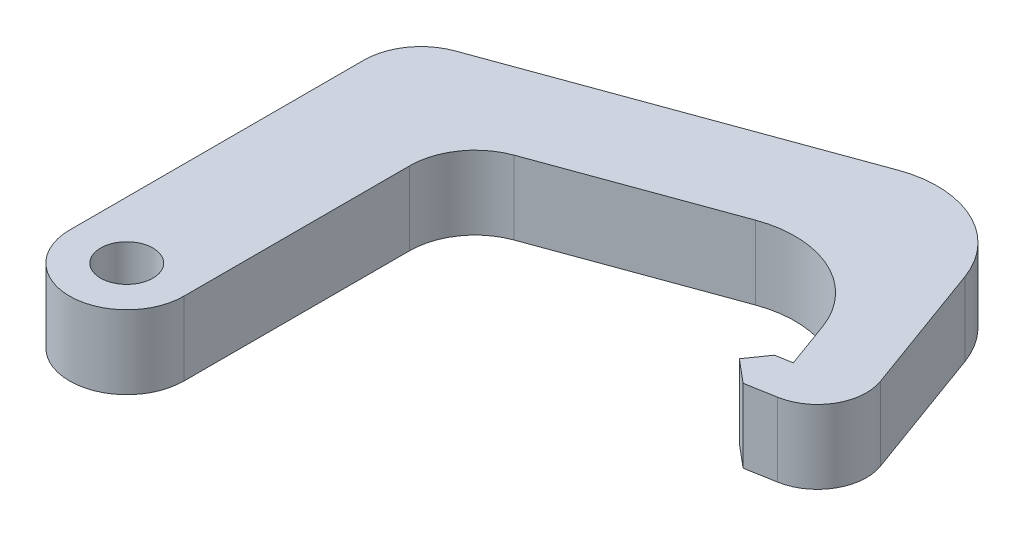
ISO-10303-21;
HEADER;
FILE_DESCRIPTION(('STEP AP214'),'2;1');
FILE_NAME('part.step','',(''),(''),'','','');
FILE_SCHEMA(('AUTOMOTIVE_DESIGN { 1 0 10303 214 1 1 1 1 }'));
ENDSEC;
DATA;
#1=APPLICATION_CONTEXT('core data for automotive mechanical design processes');
#2=APPLICATION_PROTOCOL_DEFINITION('international standard','automotive_design',2000,#1);
#3=PRODUCT_CONTEXT('',#1,'mechanical');
#4=PRODUCT('Part','Part','',(#3));
#5=PRODUCT_RELATED_PRODUCT_CATEGORY('part','',(#4));
#6=PRODUCT_DEFINITION_FORMATION('','',#4);
#7=PRODUCT_DEFINITION_CONTEXT('part definition',#1,'design');
#8=PRODUCT_DEFINITION('design','',#6,#7);
#9=PRODUCT_DEFINITION_SHAPE('','',#8);
#10=(LENGTH_UNIT() NAMED_UNIT(*) SI_UNIT(.MILLI.,.METRE.));
#11=(NAMED_UNIT(*) PLANE_ANGLE_UNIT() SI_UNIT($,.RADIAN.));
#12=(NAMED_UNIT(*) SI_UNIT($,.STERADIAN.) SOLID_ANGLE_UNIT());
#13=UNCERTAINTY_MEASURE_WITH_UNIT(LENGTH_MEASURE(1.E-05),#10,'distance_accuracy_value','');
#14=(GEOMETRIC_REPRESENTATION_CONTEXT(3) GLOBAL_UNCERTAINTY_ASSIGNED_CONTEXT((#13)) GLOBAL_UNIT_ASSIGNED_CONTEXT((#10,
#11,#12)) REPRESENTATION_CONTEXT('',''));
#15=CARTESIAN_POINT('',(0.,0.,0.));
#16=DIRECTION('',(0.,0.,1.));
#17=DIRECTION('',(1.,0.,0.));
#18=AXIS2_PLACEMENT_3D('',#15,#16,#17);
#19=CARTESIAN_POINT('',(3.5,4.5,0.));
#20=DIRECTION('',(-1.,0.,0.));
#21=DIRECTION('',(0.,0.,1.));
#22=AXIS2_PLACEMENT_3D('',#19,#20,#21);
#23=PLANE('',#22);
#24=DIRECTION('',(0.,0.,-1.));
#25=VECTOR('',#24,1.);
#26=CARTESIAN_POINT('',(3.5,0.,0.));
#27=LINE('',#26,#25);
#28=CARTESIAN_POINT('',(3.5,0.,0.));
#29=VERTEX_POINT('',#28);
#30=CARTESIAN_POINT('',(3.5,0.,-13.8126212359031));
#31=VERTEX_POINT('',#30);
#32=EDGE_CURVE('E205',#29,#31,#27,.T.);
#33=ORIENTED_EDGE('',*,*,#32,.T.);
#34=DIRECTION('',(0.,-1.,0.));
#35=VECTOR('',#34,1.);
#36=CARTESIAN_POINT('',(3.5,4.5,-13.8126212359031));
#37=LINE('',#36,#35);
#38=CARTESIAN_POINT('',(3.5,4.5,-13.8126212359031));
#39=VERTEX_POINT('',#38);
#40=EDGE_CURVE('E244',#31,#39,#37,.F.);
#41=ORIENTED_EDGE('',*,*,#40,.T.);
#42=DIRECTION('',(0.,0.,-1.));
#43=VECTOR('',#42,1.);
#44=CARTESIAN_POINT('',(3.5,4.5,0.));
#45=LINE('',#44,#43);
#46=CARTESIAN_POINT('',(3.5,4.5,0.));
#47=VERTEX_POINT('',#46);
#48=EDGE_CURVE('E343',#47,#39,#45,.T.);
#49=ORIENTED_EDGE('',*,*,#48,.F.);
#50=DIRECTION('',(0.,-1.,0.));
#51=VECTOR('',#50,1.);
#52=CARTESIAN_POINT('',(3.5,4.5,0.));
#53=LINE('',#52,#51);
#54=EDGE_CURVE('E201',#47,#29,#53,.T.);
#55=ORIENTED_EDGE('',*,*,#54,.T.);
#56=EDGE_LOOP('',(#33,#41,#49,#55));
#57=FACE_BOUND('',#56,.T.);
#58=ADVANCED_FACE('F45',(#57),#23,.F.);
#59=CARTESIAN_POINT('',(-4.93003812886465,4.5,-13.5451684361061));
#60=DIRECTION('',(0.342020143325666,0.,0.939692620785909));
#61=DIRECTION('',(0.93969262078591,0.,-0.342020143325666));
#62=AXIS2_PLACEMENT_3D('',#59,#60,#61);
#63=PLANE('',#62);
#64=DIRECTION('',(-0.939692620785909,0.,0.342020143325666));
#65=VECTOR('',#64,1.);
#66=CARTESIAN_POINT('',(-4.93003812886465,0.,-13.5451684361061));
#67=LINE('',#66,#65);
#68=CARTESIAN_POINT('',(16.959118700357,0.,-21.5121699751274));
#69=VERTEX_POINT('',#68);
#70=CARTESIAN_POINT('',(6.13191942669734,0.,-17.5713917190467));
#71=VERTEX_POINT('',#70);
#72=EDGE_CURVE('E208',#69,#71,#67,.T.);
#73=ORIENTED_EDGE('',*,*,#72,.F.);
#74=DIRECTION('',(0.,-1.,0.));
#75=VECTOR('',#74,1.);
#76=CARTESIAN_POINT('',(16.959118700357,4.5,-21.5121699751274));
#77=LINE('',#76,#75);
#78=CARTESIAN_POINT('',(16.959118700357,4.5,-21.5121699751274));
#79=VERTEX_POINT('',#78);
#80=EDGE_CURVE('E262',#69,#79,#77,.F.);
#81=ORIENTED_EDGE('',*,*,#80,.T.);
#82=DIRECTION('',(-0.939692620785909,0.,0.342020143325666));
#83=VECTOR('',#82,1.);
#84=CARTESIAN_POINT('',(-4.93003812886465,4.5,-13.5451684361061));
#85=LINE('',#84,#83);
#86=CARTESIAN_POINT('',(6.13191942669734,4.5,-17.5713917190467));
#87=VERTEX_POINT('',#86);
#88=EDGE_CURVE('E169',#79,#87,#85,.T.);
#89=ORIENTED_EDGE('',*,*,#88,.T.);
#90=DIRECTION('',(0.,-1.,0.));
#91=VECTOR('',#90,1.);
#92=CARTESIAN_POINT('',(6.13191942669734,4.5,-17.5713917190467));
#93=LINE('',#92,#91);
#94=EDGE_CURVE('E176',#87,#71,#93,.T.);
#95=ORIENTED_EDGE('',*,*,#94,.T.);
#96=EDGE_LOOP('',(#73,#81,#89,#95));
#97=FACE_BOUND('',#96,.T.);
#98=ADVANCED_FACE('F302',(#97),#63,.T.);
#99=CARTESIAN_POINT('',(27.5273125539371,4.5,-10.0191223989754));
#100=DIRECTION('',(0.939692620785909,0.,-0.342020143325666));
#101=DIRECTION('',(-0.342020143325666,0.,-0.939692620785909));
#102=AXIS2_PLACEMENT_3D('',#99,#100,#101);
#103=PLANE('',#102);
#104=DIRECTION('',(0.342020143325666,0.,0.939692620785909));
#105=VECTOR('',#104,1.);
#106=CARTESIAN_POINT('',(27.5273125539371,4.5,-10.0191223989754));
#107=LINE('',#106,#105);
#108=CARTESIAN_POINT('',(24.6493952850264,4.5,-17.926135110366));
#109=VERTEX_POINT('',#108);
#110=CARTESIAN_POINT('',(25.6754557150034,4.5,-15.1070572480082));
#111=VERTEX_POINT('',#110);
#112=EDGE_CURVE('E158',#109,#111,#107,.T.);
#113=ORIENTED_EDGE('',*,*,#112,.F.);
#114=DIRECTION('',(0.,-1.,0.));
#115=VECTOR('',#114,1.);
#116=CARTESIAN_POINT('',(24.6493952850264,4.5,-17.926135110366));
#117=LINE('',#116,#115);
#118=CARTESIAN_POINT('',(24.6493952850264,0.,-17.926135110366));
#119=VERTEX_POINT('',#118);
#120=EDGE_CURVE('E260',#109,#119,#117,.T.);
#121=ORIENTED_EDGE('',*,*,#120,.T.);
#122=DIRECTION('',(0.342020143325666,0.,0.939692620785909));
#123=VECTOR('',#122,1.);
#124=CARTESIAN_POINT('',(27.5273125539371,0.,-10.0191223989754));
#125=LINE('',#124,#123);
#126=CARTESIAN_POINT('',(25.6754557150034,0.,-15.1070572480082));
#127=VERTEX_POINT('',#126);
#128=EDGE_CURVE('E175',#119,#127,#125,.T.);
#129=ORIENTED_EDGE('',*,*,#128,.T.);
#130=DIRECTION('',(0.,-1.,0.));
#131=VECTOR('',#130,1.);
#132=CARTESIAN_POINT('',(25.6754557150034,4.5,-15.1070572480082));
#133=LINE('',#132,#131);
#134=EDGE_CURVE('E172',#111,#127,#133,.T.);
#135=ORIENTED_EDGE('',*,*,#134,.F.);
#136=EDGE_LOOP('',(#113,#121,#129,#135));
#137=FACE_BOUND('',#136,.T.);
#138=ADVANCED_FACE('F173',(#137),#103,.F.);
#139=CARTESIAN_POINT('',(-1.80924922044675,4.5,-10.2607622110774));
#140=DIRECTION('',(0.173648177666927,0.,0.984807753012209));
#141=DIRECTION('',(0.984807753012209,0.,-0.173648177666927));
#142=AXIS2_PLACEMENT_3D('',#139,#140,#141);
#143=PLANE('',#142);
#144=DIRECTION('',(-0.984807753012209,0.,0.173648177666927));
#145=VECTOR('',#144,1.);
#146=CARTESIAN_POINT('',(-1.80924922044675,0.,-10.2607622110774));
#147=LINE('',#146,#145);
#148=CARTESIAN_POINT('',(24.6906479619912,0.,-14.9334090703413));
#149=VERTEX_POINT('',#148);
#150=EDGE_CURVE('E211',#127,#149,#147,.T.);
#151=ORIENTED_EDGE('',*,*,#150,.T.);
#152=DIRECTION('',(0.,1.,0.));
#153=VECTOR('',#152,1.);
#154=CARTESIAN_POINT('',(24.6906479619912,4.5,-14.9334090703413));
#155=LINE('',#154,#153);
#156=CARTESIAN_POINT('',(24.6906479619912,4.5,-14.9334090703413));
#157=VERTEX_POINT('',#156);
#158=EDGE_CURVE('E54',#149,#157,#155,.T.);
#159=ORIENTED_EDGE('',*,*,#158,.T.);
#160=DIRECTION('',(-0.984807753012209,0.,0.173648177666927));
#161=VECTOR('',#160,1.);
#162=CARTESIAN_POINT('',(-1.80924922044675,4.5,-10.2607622110774));
#163=LINE('',#162,#161);
#164=EDGE_CURVE('E161',#111,#157,#163,.T.);
#165=ORIENTED_EDGE('',*,*,#164,.F.);
#166=ORIENTED_EDGE('',*,*,#134,.T.);
#167=EDGE_LOOP('',(#151,#159,#165,#166));
#168=FACE_BOUND('',#167,.T.);
#169=ADVANCED_FACE('F179',(#168),#143,.F.);
#170=CARTESIAN_POINT('',(16.5700417316632,4.5,-19.7474067631455));
#171=DIRECTION('',(-0.64278760968654,0.,0.766044443118978));
#172=DIRECTION('',(0.766044443118978,0.,0.64278760968654));
#173=AXIS2_PLACEMENT_3D('',#170,#171,#172);
#174=PLANE('',#173);
#175=DIRECTION('',(-0.766044443118978,0.,-0.64278760968654));
#176=VECTOR('',#175,1.);
#177=CARTESIAN_POINT('',(16.5700417316632,4.5,-19.7474067631455));
#178=LINE('',#177,#176);
#179=CARTESIAN_POINT('',(25.2210324559668,4.5,-12.4883636370643));
#180=VERTEX_POINT('',#179);
#181=CARTESIAN_POINT('',(23.8085211194927,4.5,-13.6736013785334));
#182=VERTEX_POINT('',#181);
#183=EDGE_CURVE('E180',#180,#182,#178,.T.);
#184=ORIENTED_EDGE('',*,*,#183,.T.);
#185=DIRECTION('',(0.,-1.,0.));
#186=VECTOR('',#185,1.);
#187=CARTESIAN_POINT('',(23.8085211194927,0.,-13.6736013785334));
#188=LINE('',#187,#186);
#189=CARTESIAN_POINT('',(23.8085211194927,0.,-13.6736013785334));
#190=VERTEX_POINT('',#189);
#191=EDGE_CURVE('E276',#182,#190,#188,.T.);
#192=ORIENTED_EDGE('',*,*,#191,.T.);
#193=DIRECTION('',(-0.766044443118978,0.,-0.64278760968654));
#194=VECTOR('',#193,1.);
#195=CARTESIAN_POINT('',(16.5700417316632,0.,-19.7474067631455));
#196=LINE('',#195,#194);
#197=CARTESIAN_POINT('',(25.2210324559668,0.,-12.4883636370643));
#198=VERTEX_POINT('',#197);
#199=EDGE_CURVE('E213',#198,#190,#196,.T.);
#200=ORIENTED_EDGE('',*,*,#199,.F.);
#201=DIRECTION('',(0.,-1.,0.));
#202=VECTOR('',#201,1.);
#203=CARTESIAN_POINT('',(25.2210324559668,4.5,-12.4883636370643));
#204=LINE('',#203,#202);
#205=EDGE_CURVE('E177',#180,#198,#204,.T.);
#206=ORIENTED_EDGE('',*,*,#205,.F.);
#207=EDGE_LOOP('',(#184,#192,#200,#206));
#208=FACE_BOUND('',#207,.T.);
#209=ADVANCED_FACE('F282',(#208),#174,.T.);
#210=CARTESIAN_POINT('',(-1.37512877627942,4.5,-7.79874282854692));
#211=DIRECTION('',(0.173648177666924,0.,0.984807753012209));
#212=DIRECTION('',(0.984807753012209,0.,-0.173648177666924));
#213=AXIS2_PLACEMENT_3D('',#210,#211,#212);
#214=PLANE('',#213);
#215=DIRECTION('',(-0.984807753012209,0.,0.173648177666924));
#216=VECTOR('',#215,1.);
#217=CARTESIAN_POINT('',(-1.37512877627942,0.,-7.79874282854692));
#218=LINE('',#217,#216);
#219=CARTESIAN_POINT('',(27.0227520703373,0.,-12.8060554167494));
#220=VERTEX_POINT('',#219);
#221=EDGE_CURVE('E215',#220,#198,#218,.T.);
#222=ORIENTED_EDGE('',*,*,#221,.F.);
#223=DIRECTION('',(0.,-1.,0.));
#224=VECTOR('',#223,1.);
#225=CARTESIAN_POINT('',(27.0227520703373,4.5,-12.8060554167494));
#226=LINE('',#225,#224);
#227=CARTESIAN_POINT('',(27.0227520703373,4.5,-12.8060554167494));
#228=VERTEX_POINT('',#227);
#229=EDGE_CURVE('E272',#220,#228,#226,.F.);
#230=ORIENTED_EDGE('',*,*,#229,.T.);
#231=DIRECTION('',(-0.984807753012209,0.,0.173648177666924));
#232=VECTOR('',#231,1.);
#233=CARTESIAN_POINT('',(-1.37512877627942,4.5,-7.79874282854692));
#234=LINE('',#233,#232);
#235=EDGE_CURVE('E183',#228,#180,#234,.T.);
#236=ORIENTED_EDGE('',*,*,#235,.T.);
#237=ORIENTED_EDGE('',*,*,#205,.T.);
#238=EDGE_LOOP('',(#222,#230,#236,#237));
#239=FACE_BOUND('',#238,.T.);
#240=ADVANCED_FACE('F290',(#239),#214,.T.);
#241=CARTESIAN_POINT('',(31.2860830370807,4.5,-11.387202972278));
#242=DIRECTION('',(0.939692620785909,0.,-0.342020143325666));
#243=DIRECTION('',(-0.342020143325666,0.,-0.93969262078591));
#244=AXIS2_PLACEMENT_3D('',#241,#242,#243);
#245=PLANE('',#244);
#246=DIRECTION('',(0.342020143325666,0.,0.939692620785909));
#247=VECTOR('',#246,1.);
#248=CARTESIAN_POINT('',(31.2860830370807,4.5,-11.387202972278));
#249=LINE('',#248,#247);
#250=CARTESIAN_POINT('',(26.3560449082161,4.5,-24.9323714083841));
#251=VERTEX_POINT('',#250);
#252=CARTESIAN_POINT('',(29.3208853996942,4.5,-16.786539105763));
#253=VERTEX_POINT('',#252);
#254=EDGE_CURVE('E188',#251,#253,#249,.T.);
#255=ORIENTED_EDGE('',*,*,#254,.T.);
#256=DIRECTION('',(0.,-1.,0.));
#257=VECTOR('',#256,1.);
#258=CARTESIAN_POINT('',(29.3208853996942,4.5,-16.786539105763));
#259=LINE('',#258,#257);
#260=CARTESIAN_POINT('',(29.3208853996942,0.,-16.786539105763));
#261=VERTEX_POINT('',#260);
#262=EDGE_CURVE('E267',#253,#261,#259,.T.);
#263=ORIENTED_EDGE('',*,*,#262,.T.);
#264=DIRECTION('',(0.342020143325666,0.,0.939692620785909));
#265=VECTOR('',#264,1.);
#266=CARTESIAN_POINT('',(31.2860830370807,0.,-11.387202972278));
#267=LINE('',#266,#265);
#268=CARTESIAN_POINT('',(26.3560449082161,0.,-24.9323714083841));
#269=VERTEX_POINT('',#268);
#270=EDGE_CURVE('E217',#269,#261,#267,.T.);
#271=ORIENTED_EDGE('',*,*,#270,.F.);
#272=DIRECTION('',(0.,-1.,0.));
#273=VECTOR('',#272,1.);
#274=CARTESIAN_POINT('',(26.3560449082161,4.5,-24.9323714083841));
#275=LINE('',#274,#273);
#276=EDGE_CURVE('E256',#269,#251,#275,.F.);
#277=ORIENTED_EDGE('',*,*,#276,.T.);
#278=EDGE_LOOP('',(#255,#263,#271,#277));
#279=FACE_BOUND('',#278,.T.);
#280=ADVANCED_FACE('F363',(#279),#245,.T.);
#281=CARTESIAN_POINT('',(-6.98215898881865,4.5,-19.1833241608215));
#282=DIRECTION('',(-0.342020143325666,0.,-0.939692620785909));
#283=DIRECTION('',(-0.93969262078591,0.,0.342020143325666));
#284=AXIS2_PLACEMENT_3D('',#281,#282,#283);
#285=PLANE('',#284);
#286=DIRECTION('',(0.939692620785909,0.,-0.342020143325666));
#287=VECTOR('',#286,1.);
#288=CARTESIAN_POINT('',(-6.98215898881865,4.5,-19.1833241608215));
#289=LINE('',#288,#287);
#290=CARTESIAN_POINT('',(-1.19707050163983,4.5,-21.2889241727507));
#291=VERTEX_POINT('',#290);
#292=CARTESIAN_POINT('',(18.6657683235466,4.5,-28.5184062731456));
#293=VERTEX_POINT('',#292);
#294=EDGE_CURVE('E191',#291,#293,#289,.T.);
#295=ORIENTED_EDGE('',*,*,#294,.T.);
#296=DIRECTION('',(0.,-1.,0.));
#297=VECTOR('',#296,1.);
#298=CARTESIAN_POINT('',(18.6657683235466,4.5,-28.5184062731456));
#299=LINE('',#298,#297);
#300=CARTESIAN_POINT('',(18.6657683235466,0.,-28.5184062731456));
#301=VERTEX_POINT('',#300);
#302=EDGE_CURVE('E251',#293,#301,#299,.T.);
#303=ORIENTED_EDGE('',*,*,#302,.T.);
#304=DIRECTION('',(0.939692620785909,0.,-0.342020143325666));
#305=VECTOR('',#304,1.);
#306=CARTESIAN_POINT('',(-6.98215898881865,0.,-19.1833241608215));
#307=LINE('',#306,#305);
#308=CARTESIAN_POINT('',(-1.19707050163983,0.,-21.2889241727507));
#309=VERTEX_POINT('',#308);
#310=EDGE_CURVE('E220',#309,#301,#307,.T.);
#311=ORIENTED_EDGE('',*,*,#310,.F.);
#312=DIRECTION('',(0.,-1.,0.));
#313=VECTOR('',#312,1.);
#314=CARTESIAN_POINT('',(-1.19707050163983,4.5,-21.2889241727507));
#315=LINE('',#314,#313);
#316=EDGE_CURVE('E238',#291,#309,#315,.T.);
#317=ORIENTED_EDGE('',*,*,#316,.F.);
#318=EDGE_LOOP('',(#295,#303,#311,#317));
#319=FACE_BOUND('',#318,.T.);
#320=ADVANCED_FACE('F356',(#319),#285,.T.);
#321=CARTESIAN_POINT('',(0.,4.5,-18.));
#322=DIRECTION('',(0.,-1.,0.));
#323=DIRECTION('',(0.,0.,-1.));
#324=AXIS2_PLACEMENT_3D('',#321,#322,#323);
#325=CYLINDRICAL_SURFACE('',#324,3.5);
#326=CARTESIAN_POINT('',(0.,0.,-18.));
#327=DIRECTION('',(0.,1.,0.));
#328=DIRECTION('',(0.,0.,1.));
#329=AXIS2_PLACEMENT_3D('',#326,#327,#328);
#330=CIRCLE('',#329,3.5);
#331=CARTESIAN_POINT('',(-3.5,0.,-18.));
#332=VERTEX_POINT('',#331);
#333=EDGE_CURVE('E223',#309,#332,#330,.T.);
#334=ORIENTED_EDGE('',*,*,#333,.T.);
#335=DIRECTION('',(0.,-1.,0.));
#336=VECTOR('',#335,1.);
#337=CARTESIAN_POINT('',(-3.5,4.5,-18.));
#338=LINE('',#337,#336);
#339=CARTESIAN_POINT('',(-3.5,4.5,-18.));
#340=VERTEX_POINT('',#339);
#341=EDGE_CURVE('E236',#340,#332,#338,.T.);
#342=ORIENTED_EDGE('',*,*,#341,.F.);
#343=CARTESIAN_POINT('',(0.,4.5,-18.));
#344=DIRECTION('',(0.,1.,0.));
#345=DIRECTION('',(0.,0.,1.));
#346=AXIS2_PLACEMENT_3D('',#343,#344,#345);
#347=CIRCLE('',#346,3.5);
#348=EDGE_CURVE('E194',#291,#340,#347,.T.);
#349=ORIENTED_EDGE('',*,*,#348,.F.);
#350=ORIENTED_EDGE('',*,*,#316,.T.);
#351=EDGE_LOOP('',(#334,#342,#349,#350));
#352=FACE_BOUND('',#351,.T.);
#353=ADVANCED_FACE('F353',(#352),#325,.T.);
#354=CARTESIAN_POINT('',(-3.5,4.5,0.));
#355=DIRECTION('',(-1.,0.,0.));
#356=DIRECTION('',(0.,0.,1.));
#357=AXIS2_PLACEMENT_3D('',#354,#355,#356);
#358=PLANE('',#357);
#359=DIRECTION('',(0.,0.,-1.));
#360=VECTOR('',#359,1.);
#361=CARTESIAN_POINT('',(-3.5,0.,0.));
#362=LINE('',#361,#360);
#363=CARTESIAN_POINT('',(-3.5,0.,0.));
#364=VERTEX_POINT('',#363);
#365=EDGE_CURVE('E226',#364,#332,#362,.T.);
#366=ORIENTED_EDGE('',*,*,#365,.F.);
#367=DIRECTION('',(0.,-1.,0.));
#368=VECTOR('',#367,1.);
#369=CARTESIAN_POINT('',(-3.5,4.5,0.));
#370=LINE('',#369,#368);
#371=CARTESIAN_POINT('',(-3.5,4.5,0.));
#372=VERTEX_POINT('',#371);
#373=EDGE_CURVE('E234',#372,#364,#370,.T.);
#374=ORIENTED_EDGE('',*,*,#373,.F.);
#375=DIRECTION('',(0.,0.,-1.));
#376=VECTOR('',#375,1.);
#377=CARTESIAN_POINT('',(-3.5,4.5,0.));
#378=LINE('',#377,#376);
#379=EDGE_CURVE('E196',#372,#340,#378,.T.);
#380=ORIENTED_EDGE('',*,*,#379,.T.);
#381=ORIENTED_EDGE('',*,*,#341,.T.);
#382=EDGE_LOOP('',(#366,#374,#380,#381));
#383=FACE_BOUND('',#382,.T.);
#384=ADVANCED_FACE('F318',(#383),#358,.T.);
#385=CARTESIAN_POINT('',(0.,4.5,0.));
#386=DIRECTION('',(0.,-1.,0.));
#387=DIRECTION('',(0.,0.,-1.));
#388=AXIS2_PLACEMENT_3D('',#385,#386,#387);
#389=CYLINDRICAL_SURFACE('',#388,1.6);
#390=CARTESIAN_POINT('',(0.,4.5,0.));
#391=DIRECTION('',(0.,1.,0.));
#392=DIRECTION('',(0.,0.,1.));
#393=AXIS2_PLACEMENT_3D('',#390,#391,#392);
#394=CIRCLE('',#393,1.6);
#395=CARTESIAN_POINT('',(0.,4.5,1.6));
#396=VERTEX_POINT('',#395);
#397=EDGE_CURVE('E231',#396,#396,#394,.T.);
#398=ORIENTED_EDGE('',*,*,#397,.T.);
#399=EDGE_LOOP('',(#398));
#400=FACE_BOUND('',#399,.T.);
#401=CARTESIAN_POINT('',(0.,0.,0.));
#402=DIRECTION('',(0.,1.,0.));
#403=DIRECTION('',(0.,0.,1.));
#404=AXIS2_PLACEMENT_3D('',#401,#402,#403);
#405=CIRCLE('',#404,1.6);
#406=CARTESIAN_POINT('',(0.,0.,1.6));
#407=VERTEX_POINT('',#406);
#408=EDGE_CURVE('E202',#407,#407,#405,.T.);
#409=ORIENTED_EDGE('',*,*,#408,.F.);
#410=EDGE_LOOP('',(#409));
#411=FACE_BOUND('',#410,.T.);
#412=ADVANCED_FACE('F314',(#400,#411),#389,.F.);
#413=CARTESIAN_POINT('',(0.,4.5,0.));
#414=DIRECTION('',(0.,-1.,0.));
#415=DIRECTION('',(0.,0.,-1.));
#416=AXIS2_PLACEMENT_3D('',#413,#414,#415);
#417=CYLINDRICAL_SURFACE('',#416,3.5);
#418=CARTESIAN_POINT('',(0.,0.,0.));
#419=DIRECTION('',(0.,1.,0.));
#420=DIRECTION('',(0.,0.,1.));
#421=AXIS2_PLACEMENT_3D('',#418,#419,#420);
#422=CIRCLE('',#421,3.5);
#423=EDGE_CURVE('E229',#364,#29,#422,.T.);
#424=ORIENTED_EDGE('',*,*,#423,.T.);
#425=ORIENTED_EDGE('',*,*,#54,.F.);
#426=CARTESIAN_POINT('',(0.,4.5,0.));
#427=DIRECTION('',(0.,1.,0.));
#428=DIRECTION('',(0.,0.,1.));
#429=AXIS2_PLACEMENT_3D('',#426,#427,#428);
#430=CIRCLE('',#429,3.5);
#431=EDGE_CURVE('E199',#372,#47,#430,.T.);
#432=ORIENTED_EDGE('',*,*,#431,.F.);
#433=ORIENTED_EDGE('',*,*,#373,.T.);
#434=EDGE_LOOP('',(#424,#425,#432,#433));
#435=FACE_BOUND('',#434,.T.);
#436=ADVANCED_FACE('F317',(#435),#417,.T.);
#437=CARTESIAN_POINT('',(0.,4.5,0.));
#438=DIRECTION('',(0.,1.,0.));
#439=DIRECTION('',(0.,0.,1.));
#440=AXIS2_PLACEMENT_3D('',#437,#438,#439);
#441=PLANE('',#440);
#442=ORIENTED_EDGE('',*,*,#397,.F.);
#443=EDGE_LOOP('',(#442));
#444=FACE_BOUND('',#443,.T.);
#445=ORIENTED_EDGE('',*,*,#164,.T.);
#446=DIRECTION('',(-0.573576436351052,0.,0.819152044288988));
#447=VECTOR('',#446,1.);
#448=CARTESIAN_POINT('',(9.55126630508881,4.5,6.68786866627168));
#449=LINE('',#448,#447);
#450=EDGE_CURVE('E11',#157,#182,#449,.T.);
#451=ORIENTED_EDGE('',*,*,#450,.T.);
#452=ORIENTED_EDGE('',*,*,#183,.F.);
#453=ORIENTED_EDGE('',*,*,#235,.F.);
#454=CARTESIAN_POINT('',(26.5018075373365,4.5,-15.760478675786));
#455=DIRECTION('',(0.,1.,0.));
#456=DIRECTION('',(0.,0.,1.));
#457=AXIS2_PLACEMENT_3D('',#454,#455,#456);
#458=CIRCLE('',#457,3.);
#459=EDGE_CURVE('E274',#228,#253,#458,.T.);
#460=ORIENTED_EDGE('',*,*,#459,.T.);
#461=ORIENTED_EDGE('',*,*,#254,.F.);
#462=CARTESIAN_POINT('',(20.7178891835006,4.5,-22.8802505484301));
#463=DIRECTION('',(0.,1.,0.));
#464=DIRECTION('',(0.,0.,1.));
#465=AXIS2_PLACEMENT_3D('',#462,#463,#464);
#466=CIRCLE('',#465,6.);
#467=EDGE_CURVE('E258',#251,#293,#466,.T.);
#468=ORIENTED_EDGE('',*,*,#467,.T.);
#469=ORIENTED_EDGE('',*,*,#294,.F.);
#470=ORIENTED_EDGE('',*,*,#348,.T.);
#471=ORIENTED_EDGE('',*,*,#379,.F.);
#472=ORIENTED_EDGE('',*,*,#431,.T.);
#473=ORIENTED_EDGE('',*,*,#48,.T.);
#474=CARTESIAN_POINT('',(7.5,4.5,-13.8126212359031));
#475=DIRECTION('',(0.,1.,0.));
#476=DIRECTION('',(0.,0.,1.));
#477=AXIS2_PLACEMENT_3D('',#474,#475,#476);
#478=CIRCLE('',#477,4.);
#479=EDGE_CURVE('E248',#39,#87,#478,.F.);
#480=ORIENTED_EDGE('',*,*,#479,.T.);
#481=ORIENTED_EDGE('',*,*,#88,.F.);
#482=CARTESIAN_POINT('',(19.011239560311,4.5,-15.874014250412));
#483=DIRECTION('',(0.,1.,0.));
#484=DIRECTION('',(0.,0.,1.));
#485=AXIS2_PLACEMENT_3D('',#482,#483,#484);
#486=CIRCLE('',#485,6.);
#487=EDGE_CURVE('E165',#79,#109,#486,.F.);
#488=ORIENTED_EDGE('',*,*,#487,.T.);
#489=ORIENTED_EDGE('',*,*,#112,.T.);
#490=EDGE_LOOP('',(#445,#451,#452,#453,#460,#461,#468,#469,#470,#471,#472,#473,#480,#481,#488,#489));
#491=FACE_BOUND('',#490,.T.);
#492=ADVANCED_FACE('F160',(#444,#491),#441,.T.);
#493=CARTESIAN_POINT('',(0.,0.,0.));
#494=DIRECTION('',(0.,1.,0.));
#495=DIRECTION('',(0.,0.,1.));
#496=AXIS2_PLACEMENT_3D('',#493,#494,#495);
#497=PLANE('',#496);
#498=ORIENTED_EDGE('',*,*,#408,.T.);
#499=EDGE_LOOP('',(#498));
#500=FACE_BOUND('',#499,.T.);
#501=ORIENTED_EDGE('',*,*,#199,.T.);
#502=DIRECTION('',(0.573576436351052,0.,-0.819152044288988));
#503=VECTOR('',#502,1.);
#504=CARTESIAN_POINT('',(23.8085211194927,0.,-13.6736013785334));
#505=LINE('',#504,#503);
#506=EDGE_CURVE('E68',#190,#149,#505,.T.);
#507=ORIENTED_EDGE('',*,*,#506,.T.);
#508=ORIENTED_EDGE('',*,*,#150,.F.);
#509=ORIENTED_EDGE('',*,*,#128,.F.);
#510=CARTESIAN_POINT('',(19.011239560311,0.,-15.874014250412));
#511=DIRECTION('',(0.,1.,0.));
#512=DIRECTION('',(0.,0.,1.));
#513=AXIS2_PLACEMENT_3D('',#510,#511,#512);
#514=CIRCLE('',#513,6.);
#515=EDGE_CURVE('E264',#119,#69,#514,.T.);
#516=ORIENTED_EDGE('',*,*,#515,.T.);
#517=ORIENTED_EDGE('',*,*,#72,.T.);
#518=CARTESIAN_POINT('',(7.5,0.,-13.8126212359031));
#519=DIRECTION('',(0.,1.,0.));
#520=DIRECTION('',(0.,0.,1.));
#521=AXIS2_PLACEMENT_3D('',#518,#519,#520);
#522=CIRCLE('',#521,4.);
#523=EDGE_CURVE('E246',#71,#31,#522,.T.);
#524=ORIENTED_EDGE('',*,*,#523,.T.);
#525=ORIENTED_EDGE('',*,*,#32,.F.);
#526=ORIENTED_EDGE('',*,*,#423,.F.);
#527=ORIENTED_EDGE('',*,*,#365,.T.);
#528=ORIENTED_EDGE('',*,*,#333,.F.);
#529=ORIENTED_EDGE('',*,*,#310,.T.);
#530=CARTESIAN_POINT('',(20.7178891835006,0.,-22.8802505484301));
#531=DIRECTION('',(0.,1.,0.));
#532=DIRECTION('',(0.,0.,1.));
#533=AXIS2_PLACEMENT_3D('',#530,#531,#532);
#534=CIRCLE('',#533,6.);
#535=EDGE_CURVE('E254',#301,#269,#534,.F.);
#536=ORIENTED_EDGE('',*,*,#535,.T.);
#537=ORIENTED_EDGE('',*,*,#270,.T.);
#538=CARTESIAN_POINT('',(26.5018075373365,0.,-15.760478675786));
#539=DIRECTION('',(0.,1.,0.));
#540=DIRECTION('',(0.,0.,1.));
#541=AXIS2_PLACEMENT_3D('',#538,#539,#540);
#542=CIRCLE('',#541,3.);
#543=EDGE_CURVE('E270',#261,#220,#542,.F.);
#544=ORIENTED_EDGE('',*,*,#543,.T.);
#545=ORIENTED_EDGE('',*,*,#221,.T.);
#546=EDGE_LOOP('',(#501,#507,#508,#509,#516,#517,#524,#525,#526,#527,#528,#529,#536,#537,#544,#545));
#547=FACE_BOUND('',#546,.T.);
#548=ADVANCED_FACE('F286',(#500,#547),#497,.F.);
#549=CARTESIAN_POINT('',(7.5,4.5,-13.8126212359031));
#550=DIRECTION('',(0.,-1.,0.));
#551=DIRECTION('',(0.,0.,-1.));
#552=AXIS2_PLACEMENT_3D('',#549,#550,#551);
#553=CYLINDRICAL_SURFACE('',#552,4.);
#554=ORIENTED_EDGE('',*,*,#479,.F.);
#555=ORIENTED_EDGE('',*,*,#40,.F.);
#556=ORIENTED_EDGE('',*,*,#523,.F.);
#557=ORIENTED_EDGE('',*,*,#94,.F.);
#558=EDGE_LOOP('',(#554,#555,#556,#557));
#559=FACE_BOUND('',#558,.T.);
#560=ADVANCED_FACE('F320',(#559),#553,.F.);
#561=CARTESIAN_POINT('',(20.7178891835006,4.5,-22.8802505484301));
#562=DIRECTION('',(0.,-1.,0.));
#563=DIRECTION('',(0.,0.,-1.));
#564=AXIS2_PLACEMENT_3D('',#561,#562,#563);
#565=CYLINDRICAL_SURFACE('',#564,6.);
#566=ORIENTED_EDGE('',*,*,#467,.F.);
#567=ORIENTED_EDGE('',*,*,#276,.F.);
#568=ORIENTED_EDGE('',*,*,#535,.F.);
#569=ORIENTED_EDGE('',*,*,#302,.F.);
#570=EDGE_LOOP('',(#566,#567,#568,#569));
#571=FACE_BOUND('',#570,.T.);
#572=ADVANCED_FACE('F322',(#571),#565,.T.);
#573=CARTESIAN_POINT('',(19.011239560311,4.5,-15.874014250412));
#574=DIRECTION('',(0.,-1.,0.));
#575=DIRECTION('',(0.,0.,-1.));
#576=AXIS2_PLACEMENT_3D('',#573,#574,#575);
#577=CYLINDRICAL_SURFACE('',#576,6.);
#578=ORIENTED_EDGE('',*,*,#487,.F.);
#579=ORIENTED_EDGE('',*,*,#80,.F.);
#580=ORIENTED_EDGE('',*,*,#515,.F.);
#581=ORIENTED_EDGE('',*,*,#120,.F.);
#582=EDGE_LOOP('',(#578,#579,#580,#581));
#583=FACE_BOUND('',#582,.T.);
#584=ADVANCED_FACE('F299',(#583),#577,.F.);
#585=CARTESIAN_POINT('',(26.5018075373365,4.5,-15.760478675786));
#586=DIRECTION('',(0.,-1.,0.));
#587=DIRECTION('',(0.,0.,-1.));
#588=AXIS2_PLACEMENT_3D('',#585,#586,#587);
#589=CYLINDRICAL_SURFACE('',#588,3.);
#590=ORIENTED_EDGE('',*,*,#459,.F.);
#591=ORIENTED_EDGE('',*,*,#229,.F.);
#592=ORIENTED_EDGE('',*,*,#543,.F.);
#593=ORIENTED_EDGE('',*,*,#262,.F.);
#594=EDGE_LOOP('',(#590,#591,#592,#593));
#595=FACE_BOUND('',#594,.T.);
#596=ADVANCED_FACE('F294',(#595),#589,.T.);
#597=CARTESIAN_POINT('',(23.8085211194927,4.5,-13.6736013785334));
#598=DIRECTION('',(-0.819152044288988,0.,-0.573576436351052));
#599=DIRECTION('',(0.,1.,0.));
#600=AXIS2_PLACEMENT_3D('',#597,#598,#599);
#601=PLANE('',#600);
#602=ORIENTED_EDGE('',*,*,#450,.F.);
#603=ORIENTED_EDGE('',*,*,#158,.F.);
#604=ORIENTED_EDGE('',*,*,#506,.F.);
#605=ORIENTED_EDGE('',*,*,#191,.F.);
#606=EDGE_LOOP('',(#602,#603,#604,#605));
#607=FACE_BOUND('',#606,.T.);
#608=ADVANCED_FACE('F48',(#607),#601,.T.);
#609=CLOSED_SHELL('',(#58,#98,#138,#169,#209,#240,#280,#320,#353,#384,#412,#436,#492,#548,#560,
#572,#584,#596,#608));
#610=MANIFOLD_SOLID_BREP('B2',#609);
#611=ADVANCED_BREP_SHAPE_REPRESENTATION('',(#18,#610),#14);
#612=SHAPE_DEFINITION_REPRESENTATION(#9,#611);
ENDSEC;
END-ISO-10303-21;
